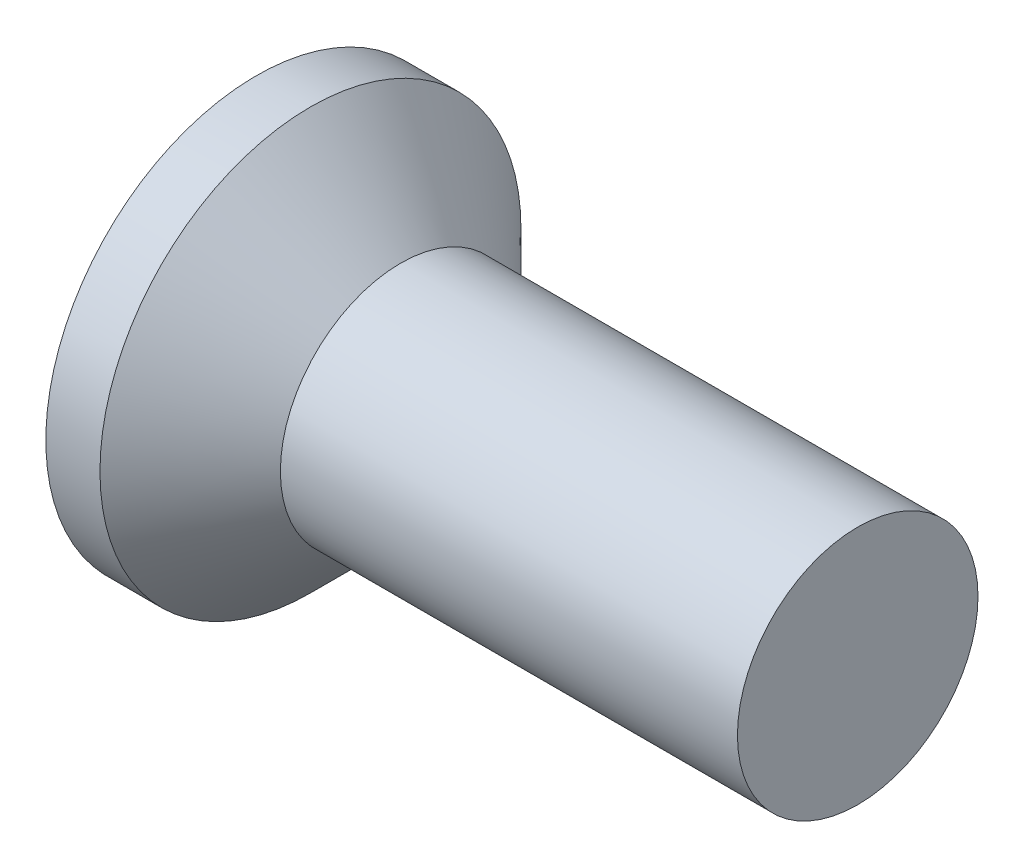
ISO-10303-21;
HEADER;
FILE_DESCRIPTION(('STEP AP214'),'2;1');
FILE_NAME('part.step','',(''),(''),'','','');
FILE_SCHEMA(('AUTOMOTIVE_DESIGN { 1 0 10303 214 1 1 1 1 }'));
ENDSEC;
DATA;
#1=APPLICATION_CONTEXT('core data for automotive mechanical design processes');
#2=APPLICATION_PROTOCOL_DEFINITION('international standard','automotive_design',2000,#1);
#3=PRODUCT_CONTEXT('',#1,'mechanical');
#4=PRODUCT('Part','Part','',(#3));
#5=PRODUCT_RELATED_PRODUCT_CATEGORY('part','',(#4));
#6=PRODUCT_DEFINITION_FORMATION('','',#4);
#7=PRODUCT_DEFINITION_CONTEXT('part definition',#1,'design');
#8=PRODUCT_DEFINITION('design','',#6,#7);
#9=PRODUCT_DEFINITION_SHAPE('','',#8);
#10=(LENGTH_UNIT() NAMED_UNIT(*) SI_UNIT(.MILLI.,.METRE.));
#11=(NAMED_UNIT(*) PLANE_ANGLE_UNIT() SI_UNIT($,.RADIAN.));
#12=(NAMED_UNIT(*) SI_UNIT($,.STERADIAN.) SOLID_ANGLE_UNIT());
#13=UNCERTAINTY_MEASURE_WITH_UNIT(LENGTH_MEASURE(1.E-05),#10,'distance_accuracy_value','');
#14=(GEOMETRIC_REPRESENTATION_CONTEXT(3) GLOBAL_UNCERTAINTY_ASSIGNED_CONTEXT((#13)) GLOBAL_UNIT_ASSIGNED_CONTEXT((#10,
#11,#12)) REPRESENTATION_CONTEXT('',''));
#15=CARTESIAN_POINT('',(0.,0.,0.));
#16=DIRECTION('',(0.,0.,1.));
#17=DIRECTION('',(1.,0.,0.));
#18=AXIS2_PLACEMENT_3D('',#15,#16,#17);
#19=CARTESIAN_POINT('',(0.6,0.19,0.19));
#20=DIRECTION('',(1.,0.,0.));
#21=DIRECTION('',(0.,0.,-1.));
#22=AXIS2_PLACEMENT_3D('',#19,#20,#21);
#23=PLANE('',#22);
#24=CARTESIAN_POINT('',(0.6,0.49,0.49));
#25=DIRECTION('',(-1.,0.,0.));
#26=DIRECTION('',(0.,0.,1.));
#27=AXIS2_PLACEMENT_3D('',#24,#25,#26);
#28=CIRCLE('',#27,0.3);
#29=CARTESIAN_POINT('',(0.6,0.49,0.19));
#30=VERTEX_POINT('',#29);
#31=CARTESIAN_POINT('',(0.6,0.19,0.49));
#32=VERTEX_POINT('',#31);
#33=EDGE_CURVE('E242',#30,#32,#28,.T.);
#34=ORIENTED_EDGE('',*,*,#33,.F.);
#35=DIRECTION('',(0.,1.,0.));
#36=VECTOR('',#35,1.);
#37=CARTESIAN_POINT('',(0.6,0.19,0.19));
#38=LINE('',#37,#36);
#39=CARTESIAN_POINT('',(0.6,0.603589838486223,0.19));
#40=VERTEX_POINT('',#39);
#41=EDGE_CURVE('E189',#40,#30,#38,.F.);
#42=ORIENTED_EDGE('',*,*,#41,.F.);
#43=DIRECTION('',(0.,0.,1.));
#44=VECTOR('',#43,1.);
#45=CARTESIAN_POINT('',(0.6,0.603589838486223,-0.19));
#46=LINE('',#45,#44);
#47=CARTESIAN_POINT('',(0.6,0.603589838486223,-0.19));
#48=VERTEX_POINT('',#47);
#49=EDGE_CURVE('E193',#48,#40,#46,.T.);
#50=ORIENTED_EDGE('',*,*,#49,.F.);
#51=DIRECTION('',(0.,1.,0.));
#52=VECTOR('',#51,1.);
#53=CARTESIAN_POINT('',(0.6,0.19,-0.19));
#54=LINE('',#53,#52);
#55=CARTESIAN_POINT('',(0.6,0.49,-0.19));
#56=VERTEX_POINT('',#55);
#57=EDGE_CURVE('E201',#56,#48,#54,.T.);
#58=ORIENTED_EDGE('',*,*,#57,.F.);
#59=CARTESIAN_POINT('',(0.6,0.49,-0.49));
#60=DIRECTION('',(-1.,0.,0.));
#61=DIRECTION('',(0.,0.,1.));
#62=AXIS2_PLACEMENT_3D('',#59,#60,#61);
#63=CIRCLE('',#62,0.3);
#64=CARTESIAN_POINT('',(0.6,0.19,-0.49));
#65=VERTEX_POINT('',#64);
#66=EDGE_CURVE('E244',#65,#56,#63,.T.);
#67=ORIENTED_EDGE('',*,*,#66,.F.);
#68=DIRECTION('',(0.,0.,-1.));
#69=VECTOR('',#68,1.);
#70=CARTESIAN_POINT('',(0.6,0.19,-0.19));
#71=LINE('',#70,#69);
#72=CARTESIAN_POINT('',(0.6,0.19,-0.603589838486224));
#73=VERTEX_POINT('',#72);
#74=EDGE_CURVE('E206',#73,#65,#71,.F.);
#75=ORIENTED_EDGE('',*,*,#74,.F.);
#76=DIRECTION('',(0.,1.,0.));
#77=VECTOR('',#76,1.);
#78=CARTESIAN_POINT('',(0.6,0.19,-0.603589838486224));
#79=LINE('',#78,#77);
#80=CARTESIAN_POINT('',(0.6,-0.19,-0.603589838486224));
#81=VERTEX_POINT('',#80);
#82=EDGE_CURVE('E138',#81,#73,#79,.T.);
#83=ORIENTED_EDGE('',*,*,#82,.F.);
#84=DIRECTION('',(0.,0.,1.));
#85=VECTOR('',#84,1.);
#86=CARTESIAN_POINT('',(0.6,-0.19,-0.19));
#87=LINE('',#86,#85);
#88=CARTESIAN_POINT('',(0.6,-0.19,-0.49));
#89=VERTEX_POINT('',#88);
#90=EDGE_CURVE('E136',#89,#81,#87,.F.);
#91=ORIENTED_EDGE('',*,*,#90,.F.);
#92=CARTESIAN_POINT('',(0.6,-0.49,-0.49));
#93=DIRECTION('',(-1.,0.,0.));
#94=DIRECTION('',(0.,0.,1.));
#95=AXIS2_PLACEMENT_3D('',#92,#93,#94);
#96=CIRCLE('',#95,0.3);
#97=CARTESIAN_POINT('',(0.6,-0.49,-0.19));
#98=VERTEX_POINT('',#97);
#99=EDGE_CURVE('E19',#98,#89,#96,.T.);
#100=ORIENTED_EDGE('',*,*,#99,.F.);
#101=DIRECTION('',(0.,1.,0.));
#102=VECTOR('',#101,1.);
#103=CARTESIAN_POINT('',(0.6,-0.19,-0.19));
#104=LINE('',#103,#102);
#105=CARTESIAN_POINT('',(0.6,-0.603589838486223,-0.19));
#106=VERTEX_POINT('',#105);
#107=EDGE_CURVE('E134',#106,#98,#104,.T.);
#108=ORIENTED_EDGE('',*,*,#107,.F.);
#109=DIRECTION('',(0.,0.,1.));
#110=VECTOR('',#109,1.);
#111=CARTESIAN_POINT('',(0.6,-0.603589838486223,-0.19));
#112=LINE('',#111,#110);
#113=CARTESIAN_POINT('',(0.6,-0.603589838486223,0.19));
#114=VERTEX_POINT('',#113);
#115=EDGE_CURVE('E157',#114,#106,#112,.F.);
#116=ORIENTED_EDGE('',*,*,#115,.F.);
#117=DIRECTION('',(0.,1.,0.));
#118=VECTOR('',#117,1.);
#119=CARTESIAN_POINT('',(0.6,-0.19,0.19));
#120=LINE('',#119,#118);
#121=CARTESIAN_POINT('',(0.6,-0.49,0.19));
#122=VERTEX_POINT('',#121);
#123=EDGE_CURVE('E167',#122,#114,#120,.F.);
#124=ORIENTED_EDGE('',*,*,#123,.F.);
#125=CARTESIAN_POINT('',(0.6,-0.49,0.49));
#126=DIRECTION('',(-1.,0.,0.));
#127=DIRECTION('',(0.,0.,1.));
#128=AXIS2_PLACEMENT_3D('',#125,#126,#127);
#129=CIRCLE('',#128,0.3);
#130=CARTESIAN_POINT('',(0.6,-0.19,0.49));
#131=VERTEX_POINT('',#130);
#132=EDGE_CURVE('E239',#131,#122,#129,.T.);
#133=ORIENTED_EDGE('',*,*,#132,.F.);
#134=DIRECTION('',(0.,0.,1.));
#135=VECTOR('',#134,1.);
#136=CARTESIAN_POINT('',(0.6,-0.19,0.19));
#137=LINE('',#136,#135);
#138=CARTESIAN_POINT('',(0.6,-0.19,0.603589838486223));
#139=VERTEX_POINT('',#138);
#140=EDGE_CURVE('E172',#139,#131,#137,.F.);
#141=ORIENTED_EDGE('',*,*,#140,.F.);
#142=DIRECTION('',(0.,1.,0.));
#143=VECTOR('',#142,1.);
#144=CARTESIAN_POINT('',(0.6,0.19,0.603589838486223));
#145=LINE('',#144,#143);
#146=CARTESIAN_POINT('',(0.6,0.19,0.603589838486223));
#147=VERTEX_POINT('',#146);
#148=EDGE_CURVE('E176',#147,#139,#145,.F.);
#149=ORIENTED_EDGE('',*,*,#148,.F.);
#150=DIRECTION('',(0.,0.,-1.));
#151=VECTOR('',#150,1.);
#152=CARTESIAN_POINT('',(0.6,0.19,0.19));
#153=LINE('',#152,#151);
#154=EDGE_CURVE('E184',#32,#147,#153,.F.);
#155=ORIENTED_EDGE('',*,*,#154,.F.);
#156=EDGE_LOOP('',(#34,#42,#50,#58,#67,#75,#83,#91,#100,#108,#116,#124,#133,#141,#149,#155));
#157=FACE_BOUND('',#156,.T.);
#158=ADVANCED_FACE('F16',(#157),#23,.F.);
#159=CARTESIAN_POINT('',(0.6,-0.19,-0.19));
#160=DIRECTION('',(0.,0.,1.));
#161=DIRECTION('',(1.,0.,0.));
#162=AXIS2_PLACEMENT_3D('',#159,#160,#161);
#163=PLANE('',#162);
#164=DIRECTION('',(0.,1.,0.));
#165=VECTOR('',#164,1.);
#166=CARTESIAN_POINT('',(0.,1.75,-0.19));
#167=LINE('',#166,#165);
#168=CARTESIAN_POINT('',(0.,-0.95,-0.19));
#169=VERTEX_POINT('',#168);
#170=CARTESIAN_POINT('',(0.,-0.49,-0.19));
#171=VERTEX_POINT('',#170);
#172=EDGE_CURVE('E156',#169,#171,#167,.T.);
#173=ORIENTED_EDGE('',*,*,#172,.F.);
#174=DIRECTION('',(-0.866025403784438,-0.500000000000001,0.));
#175=VECTOR('',#174,1.);
#176=CARTESIAN_POINT('',(0.,-0.95,-0.19));
#177=LINE('',#176,#175);
#178=EDGE_CURVE('E153',#106,#169,#177,.T.);
#179=ORIENTED_EDGE('',*,*,#178,.F.);
#180=ORIENTED_EDGE('',*,*,#107,.T.);
#181=DIRECTION('',(-1.,0.,0.));
#182=VECTOR('',#181,1.);
#183=CARTESIAN_POINT('',(0.6,-0.49,-0.19));
#184=LINE('',#183,#182);
#185=EDGE_CURVE('E133',#171,#98,#184,.F.);
#186=ORIENTED_EDGE('',*,*,#185,.F.);
#187=EDGE_LOOP('',(#173,#179,#180,#186));
#188=FACE_BOUND('',#187,.T.);
#189=ADVANCED_FACE('F546',(#188),#163,.T.);
#190=CARTESIAN_POINT('',(0.6,-0.49,-0.49));
#191=DIRECTION('',(-1.,0.,0.));
#192=DIRECTION('',(0.,0.,1.));
#193=AXIS2_PLACEMENT_3D('',#190,#191,#192);
#194=CYLINDRICAL_SURFACE('',#193,0.3);
#195=CARTESIAN_POINT('',(0.,-0.49,-0.49));
#196=DIRECTION('',(-1.,0.,0.));
#197=DIRECTION('',(0.,0.,1.));
#198=AXIS2_PLACEMENT_3D('',#195,#196,#197);
#199=CIRCLE('',#198,0.3);
#200=CARTESIAN_POINT('',(0.,-0.19,-0.49));
#201=VERTEX_POINT('',#200);
#202=EDGE_CURVE('E237',#171,#201,#199,.T.);
#203=ORIENTED_EDGE('',*,*,#202,.F.);
#204=ORIENTED_EDGE('',*,*,#185,.T.);
#205=ORIENTED_EDGE('',*,*,#99,.T.);
#206=DIRECTION('',(1.,0.,0.));
#207=VECTOR('',#206,1.);
#208=CARTESIAN_POINT('',(0.6,-0.19,-0.49));
#209=LINE('',#208,#207);
#210=EDGE_CURVE('E131',#201,#89,#209,.T.);
#211=ORIENTED_EDGE('',*,*,#210,.F.);
#212=EDGE_LOOP('',(#203,#204,#205,#211));
#213=FACE_BOUND('',#212,.T.);
#214=ADVANCED_FACE('F129',(#213),#194,.T.);
#215=CARTESIAN_POINT('',(0.6,-0.19,-0.19));
#216=DIRECTION('',(0.,1.,0.));
#217=DIRECTION('',(0.,0.,1.));
#218=AXIS2_PLACEMENT_3D('',#215,#216,#217);
#219=PLANE('',#218);
#220=ORIENTED_EDGE('',*,*,#90,.T.);
#221=DIRECTION('',(0.866025403784438,0.,0.500000000000001));
#222=VECTOR('',#221,1.);
#223=CARTESIAN_POINT('',(0.,-0.19,-0.95));
#224=LINE('',#223,#222);
#225=CARTESIAN_POINT('',(0.,-0.19,-0.95));
#226=VERTEX_POINT('',#225);
#227=EDGE_CURVE('E141',#226,#81,#224,.T.);
#228=ORIENTED_EDGE('',*,*,#227,.F.);
#229=DIRECTION('',(0.,0.,1.));
#230=VECTOR('',#229,1.);
#231=CARTESIAN_POINT('',(0.,-0.19,0.));
#232=LINE('',#231,#230);
#233=EDGE_CURVE('E145',#201,#226,#232,.F.);
#234=ORIENTED_EDGE('',*,*,#233,.F.);
#235=ORIENTED_EDGE('',*,*,#210,.T.);
#236=EDGE_LOOP('',(#220,#228,#234,#235));
#237=FACE_BOUND('',#236,.T.);
#238=ADVANCED_FACE('F143',(#237),#219,.T.);
#239=CARTESIAN_POINT('',(0.,0.19,-0.95));
#240=DIRECTION('',(-0.500000000000001,0.,0.866025403784438));
#241=DIRECTION('',(0.866025403784438,0.,0.500000000000001));
#242=AXIS2_PLACEMENT_3D('',#239,#240,#241);
#243=PLANE('',#242);
#244=ORIENTED_EDGE('',*,*,#82,.T.);
#245=DIRECTION('',(0.866025403784438,0.,0.500000000000001));
#246=VECTOR('',#245,1.);
#247=CARTESIAN_POINT('',(0.,0.19,-0.95));
#248=LINE('',#247,#246);
#249=CARTESIAN_POINT('',(0.,0.19,-0.95));
#250=VERTEX_POINT('',#249);
#251=EDGE_CURVE('E209',#250,#73,#248,.T.);
#252=ORIENTED_EDGE('',*,*,#251,.F.);
#253=DIRECTION('',(0.,1.,0.));
#254=VECTOR('',#253,1.);
#255=CARTESIAN_POINT('',(0.,1.75,-0.95));
#256=LINE('',#255,#254);
#257=EDGE_CURVE('E258',#226,#250,#256,.T.);
#258=ORIENTED_EDGE('',*,*,#257,.F.);
#259=ORIENTED_EDGE('',*,*,#227,.T.);
#260=EDGE_LOOP('',(#244,#252,#258,#259));
#261=FACE_BOUND('',#260,.T.);
#262=ADVANCED_FACE('F264',(#261),#243,.T.);
#263=CARTESIAN_POINT('',(0.6,0.19,-0.19));
#264=DIRECTION('',(0.,-1.,0.));
#265=DIRECTION('',(0.,0.,-1.));
#266=AXIS2_PLACEMENT_3D('',#263,#264,#265);
#267=PLANE('',#266);
#268=DIRECTION('',(0.,0.,1.));
#269=VECTOR('',#268,1.);
#270=CARTESIAN_POINT('',(0.,0.19,0.));
#271=LINE('',#270,#269);
#272=CARTESIAN_POINT('',(0.,0.19,-0.49));
#273=VERTEX_POINT('',#272);
#274=EDGE_CURVE('E236',#250,#273,#271,.T.);
#275=ORIENTED_EDGE('',*,*,#274,.F.);
#276=ORIENTED_EDGE('',*,*,#251,.T.);
#277=ORIENTED_EDGE('',*,*,#74,.T.);
#278=DIRECTION('',(-1.,0.,0.));
#279=VECTOR('',#278,1.);
#280=CARTESIAN_POINT('',(0.6,0.19,-0.49));
#281=LINE('',#280,#279);
#282=EDGE_CURVE('E245',#273,#65,#281,.F.);
#283=ORIENTED_EDGE('',*,*,#282,.F.);
#284=EDGE_LOOP('',(#275,#276,#277,#283));
#285=FACE_BOUND('',#284,.T.);
#286=ADVANCED_FACE('F513',(#285),#267,.T.);
#287=CARTESIAN_POINT('',(0.6,0.49,-0.49));
#288=DIRECTION('',(-1.,0.,0.));
#289=DIRECTION('',(0.,0.,1.));
#290=AXIS2_PLACEMENT_3D('',#287,#288,#289);
#291=CYLINDRICAL_SURFACE('',#290,0.3);
#292=CARTESIAN_POINT('',(0.,0.49,-0.49));
#293=DIRECTION('',(-1.,0.,0.));
#294=DIRECTION('',(0.,0.,1.));
#295=AXIS2_PLACEMENT_3D('',#292,#293,#294);
#296=CIRCLE('',#295,0.3);
#297=CARTESIAN_POINT('',(0.,0.49,-0.19));
#298=VERTEX_POINT('',#297);
#299=EDGE_CURVE('E232',#273,#298,#296,.T.);
#300=ORIENTED_EDGE('',*,*,#299,.F.);
#301=ORIENTED_EDGE('',*,*,#282,.T.);
#302=ORIENTED_EDGE('',*,*,#66,.T.);
#303=DIRECTION('',(1.,0.,0.));
#304=VECTOR('',#303,1.);
#305=CARTESIAN_POINT('',(0.6,0.49,-0.19));
#306=LINE('',#305,#304);
#307=EDGE_CURVE('E203',#298,#56,#306,.T.);
#308=ORIENTED_EDGE('',*,*,#307,.F.);
#309=EDGE_LOOP('',(#300,#301,#302,#308));
#310=FACE_BOUND('',#309,.T.);
#311=ADVANCED_FACE('F328',(#310),#291,.T.);
#312=CARTESIAN_POINT('',(0.6,0.19,-0.19));
#313=DIRECTION('',(0.,0.,1.));
#314=DIRECTION('',(1.,0.,0.));
#315=AXIS2_PLACEMENT_3D('',#312,#313,#314);
#316=PLANE('',#315);
#317=ORIENTED_EDGE('',*,*,#57,.T.);
#318=DIRECTION('',(0.866025403784438,-0.500000000000001,0.));
#319=VECTOR('',#318,1.);
#320=CARTESIAN_POINT('',(0.,0.95,-0.19));
#321=LINE('',#320,#319);
#322=CARTESIAN_POINT('',(0.,0.95,-0.19));
#323=VERTEX_POINT('',#322);
#324=EDGE_CURVE('E198',#323,#48,#321,.T.);
#325=ORIENTED_EDGE('',*,*,#324,.F.);
#326=DIRECTION('',(0.,1.,0.));
#327=VECTOR('',#326,1.);
#328=CARTESIAN_POINT('',(0.,1.75,-0.19));
#329=LINE('',#328,#327);
#330=EDGE_CURVE('E235',#298,#323,#329,.T.);
#331=ORIENTED_EDGE('',*,*,#330,.F.);
#332=ORIENTED_EDGE('',*,*,#307,.T.);
#333=EDGE_LOOP('',(#317,#325,#331,#332));
#334=FACE_BOUND('',#333,.T.);
#335=ADVANCED_FACE('F324',(#334),#316,.T.);
#336=CARTESIAN_POINT('',(0.,0.95,-0.19));
#337=DIRECTION('',(-0.500000000000001,-0.866025403784438,0.));
#338=DIRECTION('',(0.866025403784438,-0.500000000000001,0.));
#339=AXIS2_PLACEMENT_3D('',#336,#337,#338);
#340=PLANE('',#339);
#341=ORIENTED_EDGE('',*,*,#49,.T.);
#342=DIRECTION('',(0.866025403784438,-0.500000000000001,0.));
#343=VECTOR('',#342,1.);
#344=CARTESIAN_POINT('',(0.,0.95,0.19));
#345=LINE('',#344,#343);
#346=CARTESIAN_POINT('',(0.,0.95,0.19));
#347=VERTEX_POINT('',#346);
#348=EDGE_CURVE('E192',#347,#40,#345,.T.);
#349=ORIENTED_EDGE('',*,*,#348,.F.);
#350=DIRECTION('',(0.,0.,1.));
#351=VECTOR('',#350,1.);
#352=CARTESIAN_POINT('',(0.,0.95,0.));
#353=LINE('',#352,#351);
#354=EDGE_CURVE('E313',#323,#347,#353,.T.);
#355=ORIENTED_EDGE('',*,*,#354,.F.);
#356=ORIENTED_EDGE('',*,*,#324,.T.);
#357=EDGE_LOOP('',(#341,#349,#355,#356));
#358=FACE_BOUND('',#357,.T.);
#359=ADVANCED_FACE('F486',(#358),#340,.T.);
#360=CARTESIAN_POINT('',(0.6,0.19,0.19));
#361=DIRECTION('',(0.,0.,-1.));
#362=DIRECTION('',(0.,1.,0.));
#363=AXIS2_PLACEMENT_3D('',#360,#361,#362);
#364=PLANE('',#363);
#365=DIRECTION('',(0.,1.,0.));
#366=VECTOR('',#365,1.);
#367=CARTESIAN_POINT('',(0.,1.75,0.19));
#368=LINE('',#367,#366);
#369=CARTESIAN_POINT('',(0.,0.49,0.19));
#370=VERTEX_POINT('',#369);
#371=EDGE_CURVE('E231',#347,#370,#368,.F.);
#372=ORIENTED_EDGE('',*,*,#371,.F.);
#373=ORIENTED_EDGE('',*,*,#348,.T.);
#374=ORIENTED_EDGE('',*,*,#41,.T.);
#375=DIRECTION('',(-1.,0.,0.));
#376=VECTOR('',#375,1.);
#377=CARTESIAN_POINT('',(0.6,0.49,0.19));
#378=LINE('',#377,#376);
#379=EDGE_CURVE('E243',#370,#30,#378,.F.);
#380=ORIENTED_EDGE('',*,*,#379,.F.);
#381=EDGE_LOOP('',(#372,#373,#374,#380));
#382=FACE_BOUND('',#381,.T.);
#383=ADVANCED_FACE('F476',(#382),#364,.T.);
#384=CARTESIAN_POINT('',(0.6,0.49,0.49));
#385=DIRECTION('',(-1.,0.,0.));
#386=DIRECTION('',(0.,0.,1.));
#387=AXIS2_PLACEMENT_3D('',#384,#385,#386);
#388=CYLINDRICAL_SURFACE('',#387,0.3);
#389=CARTESIAN_POINT('',(0.,0.49,0.49));
#390=DIRECTION('',(-1.,0.,0.));
#391=DIRECTION('',(0.,0.,1.));
#392=AXIS2_PLACEMENT_3D('',#389,#390,#391);
#393=CIRCLE('',#392,0.3);
#394=CARTESIAN_POINT('',(0.,0.19,0.49));
#395=VERTEX_POINT('',#394);
#396=EDGE_CURVE('E227',#370,#395,#393,.T.);
#397=ORIENTED_EDGE('',*,*,#396,.F.);
#398=ORIENTED_EDGE('',*,*,#379,.T.);
#399=ORIENTED_EDGE('',*,*,#33,.T.);
#400=DIRECTION('',(1.,0.,0.));
#401=VECTOR('',#400,1.);
#402=CARTESIAN_POINT('',(0.6,0.19,0.49));
#403=LINE('',#402,#401);
#404=EDGE_CURVE('E186',#395,#32,#403,.T.);
#405=ORIENTED_EDGE('',*,*,#404,.F.);
#406=EDGE_LOOP('',(#397,#398,#399,#405));
#407=FACE_BOUND('',#406,.T.);
#408=ADVANCED_FACE('F466',(#407),#388,.T.);
#409=CARTESIAN_POINT('',(0.6,0.19,0.19));
#410=DIRECTION('',(0.,-1.,0.));
#411=DIRECTION('',(0.,0.,-1.));
#412=AXIS2_PLACEMENT_3D('',#409,#410,#411);
#413=PLANE('',#412);
#414=ORIENTED_EDGE('',*,*,#154,.T.);
#415=DIRECTION('',(-0.866025403784438,0.,0.500000000000001));
#416=VECTOR('',#415,1.);
#417=CARTESIAN_POINT('',(0.,0.19,0.95));
#418=LINE('',#417,#416);
#419=CARTESIAN_POINT('',(0.,0.19,0.95));
#420=VERTEX_POINT('',#419);
#421=EDGE_CURVE('E181',#420,#147,#418,.F.);
#422=ORIENTED_EDGE('',*,*,#421,.F.);
#423=DIRECTION('',(0.,0.,1.));
#424=VECTOR('',#423,1.);
#425=CARTESIAN_POINT('',(0.,0.19,0.));
#426=LINE('',#425,#424);
#427=EDGE_CURVE('E230',#395,#420,#426,.T.);
#428=ORIENTED_EDGE('',*,*,#427,.F.);
#429=ORIENTED_EDGE('',*,*,#404,.T.);
#430=EDGE_LOOP('',(#414,#422,#428,#429));
#431=FACE_BOUND('',#430,.T.);
#432=ADVANCED_FACE('F456',(#431),#413,.T.);
#433=CARTESIAN_POINT('',(0.,0.19,0.95));
#434=DIRECTION('',(-0.500000000000001,0.,-0.866025403784438));
#435=DIRECTION('',(-0.866025403784438,0.,0.500000000000001));
#436=AXIS2_PLACEMENT_3D('',#433,#434,#435);
#437=PLANE('',#436);
#438=ORIENTED_EDGE('',*,*,#148,.T.);
#439=DIRECTION('',(0.866025403784438,0.,-0.500000000000001));
#440=VECTOR('',#439,1.);
#441=CARTESIAN_POINT('',(0.,-0.19,0.95));
#442=LINE('',#441,#440);
#443=CARTESIAN_POINT('',(0.,-0.19,0.95));
#444=VERTEX_POINT('',#443);
#445=EDGE_CURVE('E175',#444,#139,#442,.T.);
#446=ORIENTED_EDGE('',*,*,#445,.F.);
#447=DIRECTION('',(0.,1.,0.));
#448=VECTOR('',#447,1.);
#449=CARTESIAN_POINT('',(0.,1.75,0.95));
#450=LINE('',#449,#448);
#451=EDGE_CURVE('E296',#420,#444,#450,.F.);
#452=ORIENTED_EDGE('',*,*,#451,.F.);
#453=ORIENTED_EDGE('',*,*,#421,.T.);
#454=EDGE_LOOP('',(#438,#446,#452,#453));
#455=FACE_BOUND('',#454,.T.);
#456=ADVANCED_FACE('F446',(#455),#437,.T.);
#457=CARTESIAN_POINT('',(0.6,-0.19,0.19));
#458=DIRECTION('',(0.,1.,0.));
#459=DIRECTION('',(0.,0.,1.));
#460=AXIS2_PLACEMENT_3D('',#457,#458,#459);
#461=PLANE('',#460);
#462=DIRECTION('',(0.,0.,1.));
#463=VECTOR('',#462,1.);
#464=CARTESIAN_POINT('',(0.,-0.19,0.));
#465=LINE('',#464,#463);
#466=CARTESIAN_POINT('',(0.,-0.19,0.49));
#467=VERTEX_POINT('',#466);
#468=EDGE_CURVE('E226',#444,#467,#465,.F.);
#469=ORIENTED_EDGE('',*,*,#468,.F.);
#470=ORIENTED_EDGE('',*,*,#445,.T.);
#471=ORIENTED_EDGE('',*,*,#140,.T.);
#472=DIRECTION('',(-1.,0.,0.));
#473=VECTOR('',#472,1.);
#474=CARTESIAN_POINT('',(0.6,-0.19,0.49));
#475=LINE('',#474,#473);
#476=EDGE_CURVE('E241',#467,#131,#475,.F.);
#477=ORIENTED_EDGE('',*,*,#476,.F.);
#478=EDGE_LOOP('',(#469,#470,#471,#477));
#479=FACE_BOUND('',#478,.T.);
#480=ADVANCED_FACE('F436',(#479),#461,.T.);
#481=CARTESIAN_POINT('',(0.6,-0.49,0.49));
#482=DIRECTION('',(-1.,0.,0.));
#483=DIRECTION('',(0.,0.,1.));
#484=AXIS2_PLACEMENT_3D('',#481,#482,#483);
#485=CYLINDRICAL_SURFACE('',#484,0.3);
#486=CARTESIAN_POINT('',(0.,-0.49,0.49));
#487=DIRECTION('',(-1.,0.,0.));
#488=DIRECTION('',(0.,0.,1.));
#489=AXIS2_PLACEMENT_3D('',#486,#487,#488);
#490=CIRCLE('',#489,0.3);
#491=CARTESIAN_POINT('',(0.,-0.49,0.19));
#492=VERTEX_POINT('',#491);
#493=EDGE_CURVE('E222',#467,#492,#490,.T.);
#494=ORIENTED_EDGE('',*,*,#493,.F.);
#495=ORIENTED_EDGE('',*,*,#476,.T.);
#496=ORIENTED_EDGE('',*,*,#132,.T.);
#497=DIRECTION('',(1.,0.,0.));
#498=VECTOR('',#497,1.);
#499=CARTESIAN_POINT('',(0.6,-0.49,0.19));
#500=LINE('',#499,#498);
#501=EDGE_CURVE('E169',#492,#122,#500,.T.);
#502=ORIENTED_EDGE('',*,*,#501,.F.);
#503=EDGE_LOOP('',(#494,#495,#496,#502));
#504=FACE_BOUND('',#503,.T.);
#505=ADVANCED_FACE('F427',(#504),#485,.T.);
#506=CARTESIAN_POINT('',(0.6,-0.19,0.19));
#507=DIRECTION('',(0.,0.,-1.));
#508=DIRECTION('',(0.,1.,0.));
#509=AXIS2_PLACEMENT_3D('',#506,#507,#508);
#510=PLANE('',#509);
#511=ORIENTED_EDGE('',*,*,#123,.T.);
#512=DIRECTION('',(-0.866025403784438,-0.500000000000001,0.));
#513=VECTOR('',#512,1.);
#514=CARTESIAN_POINT('',(0.,-0.95,0.19));
#515=LINE('',#514,#513);
#516=CARTESIAN_POINT('',(0.,-0.95,0.19));
#517=VERTEX_POINT('',#516);
#518=EDGE_CURVE('E34',#517,#114,#515,.F.);
#519=ORIENTED_EDGE('',*,*,#518,.F.);
#520=DIRECTION('',(0.,1.,0.));
#521=VECTOR('',#520,1.);
#522=CARTESIAN_POINT('',(0.,1.75,0.19));
#523=LINE('',#522,#521);
#524=EDGE_CURVE('E225',#492,#517,#523,.F.);
#525=ORIENTED_EDGE('',*,*,#524,.F.);
#526=ORIENTED_EDGE('',*,*,#501,.T.);
#527=EDGE_LOOP('',(#511,#519,#525,#526));
#528=FACE_BOUND('',#527,.T.);
#529=ADVANCED_FACE('F417',(#528),#510,.T.);
#530=CARTESIAN_POINT('',(0.,-0.95,-0.19));
#531=DIRECTION('',(-0.500000000000001,0.866025403784438,0.));
#532=DIRECTION('',(-0.866025403784438,-0.500000000000001,0.));
#533=AXIS2_PLACEMENT_3D('',#530,#531,#532);
#534=PLANE('',#533);
#535=ORIENTED_EDGE('',*,*,#115,.T.);
#536=ORIENTED_EDGE('',*,*,#178,.T.);
#537=DIRECTION('',(0.,0.,1.));
#538=VECTOR('',#537,1.);
#539=CARTESIAN_POINT('',(0.,-0.95,0.));
#540=LINE('',#539,#538);
#541=EDGE_CURVE('E221',#517,#169,#540,.F.);
#542=ORIENTED_EDGE('',*,*,#541,.F.);
#543=ORIENTED_EDGE('',*,*,#518,.T.);
#544=EDGE_LOOP('',(#535,#536,#542,#543));
#545=FACE_BOUND('',#544,.T.);
#546=ADVANCED_FACE('F408',(#545),#534,.T.);
#547=CARTESIAN_POINT('',(0.,1.75,0.));
#548=DIRECTION('',(-1.,0.,0.));
#549=DIRECTION('',(0.,0.,1.));
#550=AXIS2_PLACEMENT_3D('',#547,#548,#549);
#551=PLANE('',#550);
#552=ORIENTED_EDGE('',*,*,#524,.T.);
#553=ORIENTED_EDGE('',*,*,#541,.T.);
#554=ORIENTED_EDGE('',*,*,#172,.T.);
#555=ORIENTED_EDGE('',*,*,#202,.T.);
#556=ORIENTED_EDGE('',*,*,#233,.T.);
#557=ORIENTED_EDGE('',*,*,#257,.T.);
#558=ORIENTED_EDGE('',*,*,#274,.T.);
#559=ORIENTED_EDGE('',*,*,#299,.T.);
#560=ORIENTED_EDGE('',*,*,#330,.T.);
#561=ORIENTED_EDGE('',*,*,#354,.T.);
#562=ORIENTED_EDGE('',*,*,#371,.T.);
#563=ORIENTED_EDGE('',*,*,#396,.T.);
#564=ORIENTED_EDGE('',*,*,#427,.T.);
#565=ORIENTED_EDGE('',*,*,#451,.T.);
#566=ORIENTED_EDGE('',*,*,#468,.T.);
#567=ORIENTED_EDGE('',*,*,#493,.T.);
#568=EDGE_LOOP('',(#552,#553,#554,#555,#556,#557,#558,#559,#560,#561,#562,#563,#564,#565,#566,#567));
#569=FACE_BOUND('',#568,.T.);
#570=CARTESIAN_POINT('',(0.,0.,0.));
#571=DIRECTION('',(1.,0.,0.));
#572=DIRECTION('',(0.,0.,-1.));
#573=AXIS2_PLACEMENT_3D('',#570,#571,#572);
#574=CIRCLE('',#573,1.75);
#575=CARTESIAN_POINT('',(0.,0.,-1.75));
#576=VERTEX_POINT('',#575);
#577=EDGE_CURVE('E217',#576,#576,#574,.T.);
#578=ORIENTED_EDGE('',*,*,#577,.F.);
#579=EDGE_LOOP('',(#578));
#580=FACE_BOUND('',#579,.T.);
#581=ADVANCED_FACE('F268',(#569,#580),#551,.T.);
#582=CARTESIAN_POINT('',(4.51581291088132,0.,0.));
#583=DIRECTION('',(1.,0.,0.));
#584=DIRECTION('',(0.,0.,-1.));
#585=AXIS2_PLACEMENT_3D('',#582,#583,#584);
#586=CYLINDRICAL_SURFACE('',#585,1.75);
#587=CARTESIAN_POINT('',(0.449999999943884,0.,0.));
#588=DIRECTION('',(-1.,0.,0.));
#589=DIRECTION('',(0.,0.,1.));
#590=AXIS2_PLACEMENT_3D('',#587,#588,#589);
#591=CIRCLE('',#590,1.75000000001546);
#592=CARTESIAN_POINT('',(0.449999999943884,0.,1.75000000001546));
#593=VERTEX_POINT('',#592);
#594=EDGE_CURVE('E220',#593,#593,#591,.F.);
#595=ORIENTED_EDGE('',*,*,#594,.F.);
#596=EDGE_LOOP('',(#595));
#597=FACE_BOUND('',#596,.T.);
#598=ORIENTED_EDGE('',*,*,#577,.T.);
#599=EDGE_LOOP('',(#598));
#600=FACE_BOUND('',#599,.T.);
#601=ADVANCED_FACE('F358',(#597,#600),#586,.T.);
#602=CARTESIAN_POINT('',(0.449999999943884,0.,0.));
#603=DIRECTION('',(-1.,0.,0.));
#604=DIRECTION('',(0.,-1.,0.));
#605=AXIS2_PLACEMENT_3D('',#602,#603,#604);
#606=CONICAL_SURFACE('',#605,1.75000000001546,0.785398163397448);
#607=ORIENTED_EDGE('',*,*,#594,.T.);
#608=EDGE_LOOP('',(#607));
#609=FACE_BOUND('',#608,.T.);
#610=CARTESIAN_POINT('',(1.2,0.,0.));
#611=DIRECTION('',(1.,0.,0.));
#612=DIRECTION('',(0.,0.,-1.));
#613=AXIS2_PLACEMENT_3D('',#610,#611,#612);
#614=CIRCLE('',#613,1.);
#615=CARTESIAN_POINT('',(1.2,0.,-1.));
#616=VERTEX_POINT('',#615);
#617=EDGE_CURVE('E25',#616,#616,#614,.T.);
#618=ORIENTED_EDGE('',*,*,#617,.F.);
#619=EDGE_LOOP('',(#618));
#620=FACE_BOUND('',#619,.T.);
#621=ADVANCED_FACE('F355',(#609,#620),#606,.T.);
#622=CARTESIAN_POINT('',(5.,1.,0.));
#623=DIRECTION('',(1.,0.,0.));
#624=DIRECTION('',(0.,0.,-1.));
#625=AXIS2_PLACEMENT_3D('',#622,#623,#624);
#626=PLANE('',#625);
#627=CARTESIAN_POINT('',(5.,0.,0.));
#628=DIRECTION('',(1.,0.,0.));
#629=DIRECTION('',(0.,0.,-1.));
#630=AXIS2_PLACEMENT_3D('',#627,#628,#629);
#631=CIRCLE('',#630,1.);
#632=CARTESIAN_POINT('',(5.,0.,-1.));
#633=VERTEX_POINT('',#632);
#634=EDGE_CURVE('E11',#633,#633,#631,.F.);
#635=ORIENTED_EDGE('',*,*,#634,.F.);
#636=EDGE_LOOP('',(#635));
#637=FACE_BOUND('',#636,.T.);
#638=ADVANCED_FACE('F357',(#637),#626,.T.);
#639=CARTESIAN_POINT('',(4.51581291088132,0.,0.));
#640=DIRECTION('',(1.,0.,0.));
#641=DIRECTION('',(0.,0.,-1.));
#642=AXIS2_PLACEMENT_3D('',#639,#640,#641);
#643=CYLINDRICAL_SURFACE('',#642,1.);
#644=ORIENTED_EDGE('',*,*,#634,.T.);
#645=EDGE_LOOP('',(#644));
#646=FACE_BOUND('',#645,.T.);
#647=ORIENTED_EDGE('',*,*,#617,.T.);
#648=EDGE_LOOP('',(#647));
#649=FACE_BOUND('',#648,.T.);
#650=ADVANCED_FACE('F353',(#646,#649),#643,.T.);
#651=CLOSED_SHELL('',(#158,#189,#214,#238,#262,#286,#311,#335,#359,#383,#408,#432,#456,#480,
#505,#529,#546,#581,#601,#621,#638,#650));
#652=MANIFOLD_SOLID_BREP('B1',#651);
#653=ADVANCED_BREP_SHAPE_REPRESENTATION('',(#18,#652),#14);
#654=SHAPE_DEFINITION_REPRESENTATION(#9,#653);
ENDSEC;
END-ISO-10303-21;
